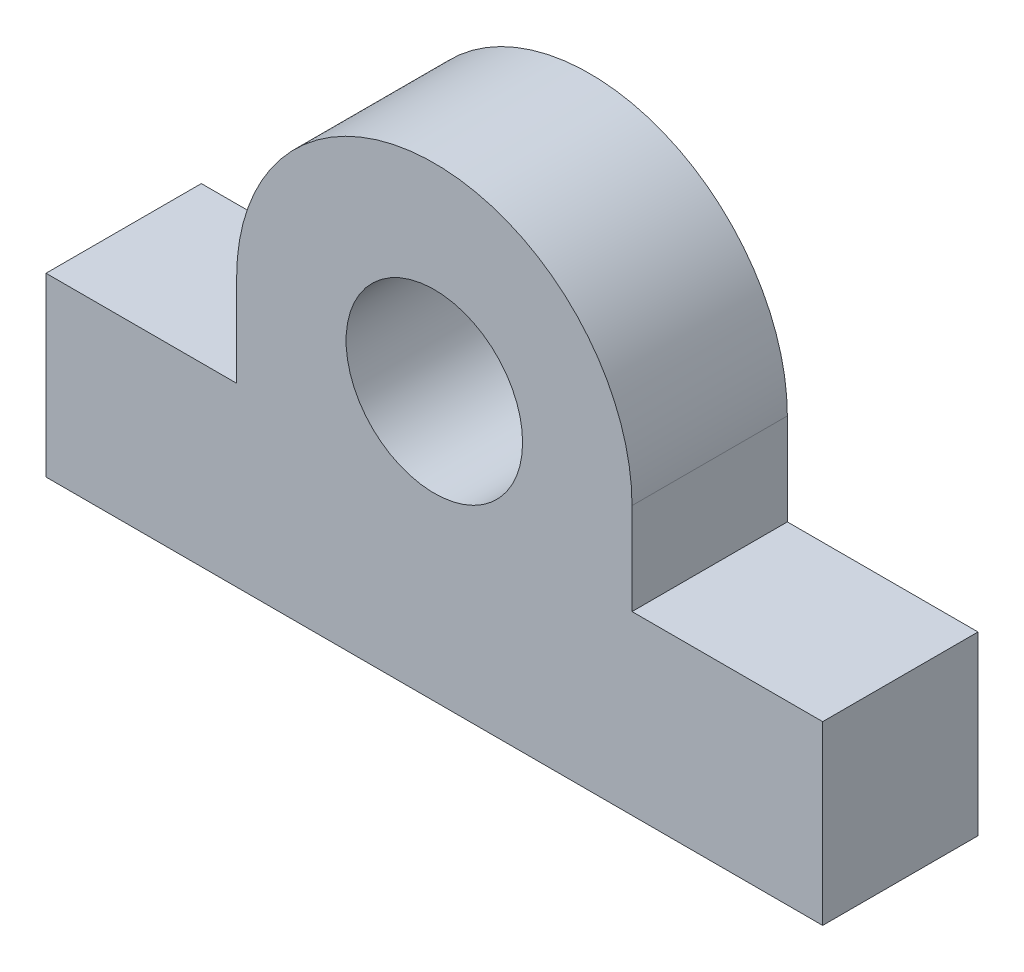
ISO-10303-21;
HEADER;
FILE_DESCRIPTION(('STEP AP214'),'2;1');
FILE_NAME('part.step','',(''),(''),'','','');
FILE_SCHEMA(('AUTOMOTIVE_DESIGN { 1 0 10303 214 1 1 1 1 }'));
ENDSEC;
DATA;
#1=APPLICATION_CONTEXT('core data for automotive mechanical design processes');
#2=APPLICATION_PROTOCOL_DEFINITION('international standard','automotive_design',2000,#1);
#3=PRODUCT_CONTEXT('',#1,'mechanical');
#4=PRODUCT('Part','Part','',(#3));
#5=PRODUCT_RELATED_PRODUCT_CATEGORY('part','',(#4));
#6=PRODUCT_DEFINITION_FORMATION('','',#4);
#7=PRODUCT_DEFINITION_CONTEXT('part definition',#1,'design');
#8=PRODUCT_DEFINITION('design','',#6,#7);
#9=PRODUCT_DEFINITION_SHAPE('','',#8);
#10=(LENGTH_UNIT() NAMED_UNIT(*) SI_UNIT(.MILLI.,.METRE.));
#11=(NAMED_UNIT(*) PLANE_ANGLE_UNIT() SI_UNIT($,.RADIAN.));
#12=(NAMED_UNIT(*) SI_UNIT($,.STERADIAN.) SOLID_ANGLE_UNIT());
#13=UNCERTAINTY_MEASURE_WITH_UNIT(LENGTH_MEASURE(1.E-05),#10,'distance_accuracy_value','');
#14=(GEOMETRIC_REPRESENTATION_CONTEXT(3) GLOBAL_UNCERTAINTY_ASSIGNED_CONTEXT((#13)) GLOBAL_UNIT_ASSIGNED_CONTEXT((#10,
#11,#12)) REPRESENTATION_CONTEXT('',''));
#15=CARTESIAN_POINT('',(0.,0.,0.));
#16=DIRECTION('',(0.,0.,1.));
#17=DIRECTION('',(1.,0.,0.));
#18=AXIS2_PLACEMENT_3D('',#15,#16,#17);
#19=CARTESIAN_POINT('',(0.,38.,11.));
#20=DIRECTION('',(0.,0.,-1.));
#21=DIRECTION('',(-1.,0.,0.));
#22=AXIS2_PLACEMENT_3D('',#19,#20,#21);
#23=PLANE('',#22);
#24=DIRECTION('',(0.,-1.,0.));
#25=VECTOR('',#24,1.);
#26=CARTESIAN_POINT('',(-55.,0.,11.));
#27=LINE('',#26,#25);
#28=CARTESIAN_POINT('',(-55.,25.,11.));
#29=VERTEX_POINT('',#28);
#30=CARTESIAN_POINT('',(-55.,0.,11.));
#31=VERTEX_POINT('',#30);
#32=EDGE_CURVE('E144',#29,#31,#27,.T.);
#33=ORIENTED_EDGE('',*,*,#32,.T.);
#34=DIRECTION('',(1.,0.,0.));
#35=VECTOR('',#34,1.);
#36=CARTESIAN_POINT('',(-55.,0.,11.));
#37=LINE('',#36,#35);
#38=CARTESIAN_POINT('',(55.,0.,11.));
#39=VERTEX_POINT('',#38);
#40=EDGE_CURVE('E92',#31,#39,#37,.T.);
#41=ORIENTED_EDGE('',*,*,#40,.T.);
#42=DIRECTION('',(0.,1.,0.));
#43=VECTOR('',#42,1.);
#44=CARTESIAN_POINT('',(55.,0.,11.));
#45=LINE('',#44,#43);
#46=CARTESIAN_POINT('',(55.,25.,11.));
#47=VERTEX_POINT('',#46);
#48=EDGE_CURVE('E159',#39,#47,#45,.T.);
#49=ORIENTED_EDGE('',*,*,#48,.T.);
#50=DIRECTION('',(-1.,0.,0.));
#51=VECTOR('',#50,1.);
#52=CARTESIAN_POINT('',(28.,25.,11.));
#53=LINE('',#52,#51);
#54=CARTESIAN_POINT('',(28.,25.,11.));
#55=VERTEX_POINT('',#54);
#56=EDGE_CURVE('E172',#47,#55,#53,.T.);
#57=ORIENTED_EDGE('',*,*,#56,.T.);
#58=DIRECTION('',(0.,1.,0.));
#59=VECTOR('',#58,1.);
#60=CARTESIAN_POINT('',(28.,25.,11.));
#61=LINE('',#60,#59);
#62=CARTESIAN_POINT('',(28.,38.,11.));
#63=VERTEX_POINT('',#62);
#64=EDGE_CURVE('E111',#55,#63,#61,.T.);
#65=ORIENTED_EDGE('',*,*,#64,.T.);
#66=CARTESIAN_POINT('',(0.,38.,11.));
#67=DIRECTION('',(0.,0.,1.));
#68=DIRECTION('',(-1.,0.,0.));
#69=AXIS2_PLACEMENT_3D('',#66,#67,#68);
#70=CIRCLE('',#69,28.);
#71=CARTESIAN_POINT('',(-28.,38.,11.));
#72=VERTEX_POINT('',#71);
#73=EDGE_CURVE('E105',#63,#72,#70,.T.);
#74=ORIENTED_EDGE('',*,*,#73,.T.);
#75=DIRECTION('',(0.,-1.,0.));
#76=VECTOR('',#75,1.);
#77=CARTESIAN_POINT('',(-28.,25.,11.));
#78=LINE('',#77,#76);
#79=CARTESIAN_POINT('',(-28.,25.,11.));
#80=VERTEX_POINT('',#79);
#81=EDGE_CURVE('E109',#72,#80,#78,.T.);
#82=ORIENTED_EDGE('',*,*,#81,.T.);
#83=DIRECTION('',(-1.,0.,0.));
#84=VECTOR('',#83,1.);
#85=CARTESIAN_POINT('',(-55.,25.,11.));
#86=LINE('',#85,#84);
#87=EDGE_CURVE('E49',#80,#29,#86,.T.);
#88=ORIENTED_EDGE('',*,*,#87,.T.);
#89=EDGE_LOOP('',(#33,#41,#49,#57,#65,#74,#82,#88));
#90=FACE_BOUND('',#89,.T.);
#91=CARTESIAN_POINT('',(0.,38.,11.));
#92=DIRECTION('',(0.,0.,1.));
#93=DIRECTION('',(1.,0.,0.));
#94=AXIS2_PLACEMENT_3D('',#91,#92,#93);
#95=CIRCLE('',#94,12.5);
#96=CARTESIAN_POINT('',(12.5,38.,11.));
#97=VERTEX_POINT('',#96);
#98=EDGE_CURVE('E133',#97,#97,#95,.T.);
#99=ORIENTED_EDGE('',*,*,#98,.F.);
#100=EDGE_LOOP('',(#99));
#101=FACE_BOUND('',#100,.T.);
#102=ADVANCED_FACE('F32',(#90,#101),#23,.F.);
#103=CARTESIAN_POINT('',(0.,38.,-11.));
#104=DIRECTION('',(0.,0.,-1.));
#105=DIRECTION('',(-1.,0.,0.));
#106=AXIS2_PLACEMENT_3D('',#103,#104,#105);
#107=PLANE('',#106);
#108=DIRECTION('',(0.,-1.,0.));
#109=VECTOR('',#108,1.);
#110=CARTESIAN_POINT('',(-55.,0.,-11.));
#111=LINE('',#110,#109);
#112=CARTESIAN_POINT('',(-55.,25.,-11.));
#113=VERTEX_POINT('',#112);
#114=CARTESIAN_POINT('',(-55.,0.,-11.));
#115=VERTEX_POINT('',#114);
#116=EDGE_CURVE('E129',#113,#115,#111,.T.);
#117=ORIENTED_EDGE('',*,*,#116,.F.);
#118=DIRECTION('',(-1.,0.,0.));
#119=VECTOR('',#118,1.);
#120=CARTESIAN_POINT('',(-55.,25.,-11.));
#121=LINE('',#120,#119);
#122=CARTESIAN_POINT('',(-28.,25.,-11.));
#123=VERTEX_POINT('',#122);
#124=EDGE_CURVE('E84',#123,#113,#121,.T.);
#125=ORIENTED_EDGE('',*,*,#124,.F.);
#126=DIRECTION('',(0.,-1.,0.));
#127=VECTOR('',#126,1.);
#128=CARTESIAN_POINT('',(-28.,25.,-11.));
#129=LINE('',#128,#127);
#130=CARTESIAN_POINT('',(-28.,38.,-11.));
#131=VERTEX_POINT('',#130);
#132=EDGE_CURVE('E78',#131,#123,#129,.T.);
#133=ORIENTED_EDGE('',*,*,#132,.F.);
#134=CARTESIAN_POINT('',(0.,38.,-11.));
#135=DIRECTION('',(0.,0.,1.));
#136=DIRECTION('',(-1.,0.,0.));
#137=AXIS2_PLACEMENT_3D('',#134,#135,#136);
#138=CIRCLE('',#137,28.);
#139=CARTESIAN_POINT('',(28.,38.,-11.));
#140=VERTEX_POINT('',#139);
#141=EDGE_CURVE('E119',#140,#131,#138,.T.);
#142=ORIENTED_EDGE('',*,*,#141,.F.);
#143=DIRECTION('',(0.,1.,0.));
#144=VECTOR('',#143,1.);
#145=CARTESIAN_POINT('',(28.,25.,-11.));
#146=LINE('',#145,#144);
#147=CARTESIAN_POINT('',(28.,25.,-11.));
#148=VERTEX_POINT('',#147);
#149=EDGE_CURVE('E139',#148,#140,#146,.T.);
#150=ORIENTED_EDGE('',*,*,#149,.F.);
#151=DIRECTION('',(-1.,0.,0.));
#152=VECTOR('',#151,1.);
#153=CARTESIAN_POINT('',(28.,25.,-11.));
#154=LINE('',#153,#152);
#155=CARTESIAN_POINT('',(55.,25.,-11.));
#156=VERTEX_POINT('',#155);
#157=EDGE_CURVE('E137',#156,#148,#154,.T.);
#158=ORIENTED_EDGE('',*,*,#157,.F.);
#159=DIRECTION('',(0.,1.,0.));
#160=VECTOR('',#159,1.);
#161=CARTESIAN_POINT('',(55.,0.,-11.));
#162=LINE('',#161,#160);
#163=CARTESIAN_POINT('',(55.,0.,-11.));
#164=VERTEX_POINT('',#163);
#165=EDGE_CURVE('E135',#164,#156,#162,.T.);
#166=ORIENTED_EDGE('',*,*,#165,.F.);
#167=DIRECTION('',(1.,0.,0.));
#168=VECTOR('',#167,1.);
#169=CARTESIAN_POINT('',(-55.,0.,-11.));
#170=LINE('',#169,#168);
#171=EDGE_CURVE('E132',#115,#164,#170,.T.);
#172=ORIENTED_EDGE('',*,*,#171,.F.);
#173=EDGE_LOOP('',(#117,#125,#133,#142,#150,#158,#166,#172));
#174=FACE_BOUND('',#173,.T.);
#175=CARTESIAN_POINT('',(0.,38.,-11.));
#176=DIRECTION('',(0.,0.,1.));
#177=DIRECTION('',(1.,0.,0.));
#178=AXIS2_PLACEMENT_3D('',#175,#176,#177);
#179=CIRCLE('',#178,12.5);
#180=CARTESIAN_POINT('',(12.5,38.,-11.));
#181=VERTEX_POINT('',#180);
#182=EDGE_CURVE('E178',#181,#181,#179,.T.);
#183=ORIENTED_EDGE('',*,*,#182,.T.);
#184=EDGE_LOOP('',(#183));
#185=FACE_BOUND('',#184,.T.);
#186=ADVANCED_FACE('F163',(#174,#185),#107,.T.);
#187=CARTESIAN_POINT('',(-55.,0.,11.));
#188=DIRECTION('',(1.,0.,0.));
#189=DIRECTION('',(0.,0.,-1.));
#190=AXIS2_PLACEMENT_3D('',#187,#188,#189);
#191=PLANE('',#190);
#192=ORIENTED_EDGE('',*,*,#116,.T.);
#193=DIRECTION('',(0.,0.,-1.));
#194=VECTOR('',#193,1.);
#195=CARTESIAN_POINT('',(-55.,0.,11.));
#196=LINE('',#195,#194);
#197=EDGE_CURVE('E11',#31,#115,#196,.T.);
#198=ORIENTED_EDGE('',*,*,#197,.F.);
#199=ORIENTED_EDGE('',*,*,#32,.F.);
#200=DIRECTION('',(0.,0.,-1.));
#201=VECTOR('',#200,1.);
#202=CARTESIAN_POINT('',(-55.,25.,11.));
#203=LINE('',#202,#201);
#204=EDGE_CURVE('E125',#29,#113,#203,.T.);
#205=ORIENTED_EDGE('',*,*,#204,.T.);
#206=EDGE_LOOP('',(#192,#198,#199,#205));
#207=FACE_BOUND('',#206,.T.);
#208=ADVANCED_FACE('F34',(#207),#191,.F.);
#209=CARTESIAN_POINT('',(-55.,0.,11.));
#210=DIRECTION('',(0.,1.,0.));
#211=DIRECTION('',(0.,0.,1.));
#212=AXIS2_PLACEMENT_3D('',#209,#210,#211);
#213=PLANE('',#212);
#214=ORIENTED_EDGE('',*,*,#171,.T.);
#215=DIRECTION('',(0.,0.,-1.));
#216=VECTOR('',#215,1.);
#217=CARTESIAN_POINT('',(55.,0.,11.));
#218=LINE('',#217,#216);
#219=EDGE_CURVE('E41',#39,#164,#218,.T.);
#220=ORIENTED_EDGE('',*,*,#219,.F.);
#221=ORIENTED_EDGE('',*,*,#40,.F.);
#222=ORIENTED_EDGE('',*,*,#197,.T.);
#223=EDGE_LOOP('',(#214,#220,#221,#222));
#224=FACE_BOUND('',#223,.T.);
#225=ADVANCED_FACE('F206',(#224),#213,.F.);
#226=CARTESIAN_POINT('',(55.,0.,11.));
#227=DIRECTION('',(-1.,0.,0.));
#228=DIRECTION('',(0.,-1.,0.));
#229=AXIS2_PLACEMENT_3D('',#226,#227,#228);
#230=PLANE('',#229);
#231=ORIENTED_EDGE('',*,*,#165,.T.);
#232=DIRECTION('',(0.,0.,-1.));
#233=VECTOR('',#232,1.);
#234=CARTESIAN_POINT('',(55.,25.,11.));
#235=LINE('',#234,#233);
#236=EDGE_CURVE('E151',#47,#156,#235,.T.);
#237=ORIENTED_EDGE('',*,*,#236,.F.);
#238=ORIENTED_EDGE('',*,*,#48,.F.);
#239=ORIENTED_EDGE('',*,*,#219,.T.);
#240=EDGE_LOOP('',(#231,#237,#238,#239));
#241=FACE_BOUND('',#240,.T.);
#242=ADVANCED_FACE('F157',(#241),#230,.F.);
#243=CARTESIAN_POINT('',(28.,25.,11.));
#244=DIRECTION('',(0.,-1.,0.));
#245=DIRECTION('',(1.,0.,0.));
#246=AXIS2_PLACEMENT_3D('',#243,#244,#245);
#247=PLANE('',#246);
#248=ORIENTED_EDGE('',*,*,#157,.T.);
#249=DIRECTION('',(0.,0.,-1.));
#250=VECTOR('',#249,1.);
#251=CARTESIAN_POINT('',(28.,25.,11.));
#252=LINE('',#251,#250);
#253=EDGE_CURVE('E148',#55,#148,#252,.T.);
#254=ORIENTED_EDGE('',*,*,#253,.F.);
#255=ORIENTED_EDGE('',*,*,#56,.F.);
#256=ORIENTED_EDGE('',*,*,#236,.T.);
#257=EDGE_LOOP('',(#248,#254,#255,#256));
#258=FACE_BOUND('',#257,.T.);
#259=ADVANCED_FACE('F168',(#258),#247,.F.);
#260=CARTESIAN_POINT('',(28.,25.,11.));
#261=DIRECTION('',(-1.,0.,0.));
#262=DIRECTION('',(0.,-1.,0.));
#263=AXIS2_PLACEMENT_3D('',#260,#261,#262);
#264=PLANE('',#263);
#265=ORIENTED_EDGE('',*,*,#149,.T.);
#266=DIRECTION('',(0.,0.,-1.));
#267=VECTOR('',#266,1.);
#268=CARTESIAN_POINT('',(28.,38.,11.));
#269=LINE('',#268,#267);
#270=EDGE_CURVE('E120',#63,#140,#269,.T.);
#271=ORIENTED_EDGE('',*,*,#270,.F.);
#272=ORIENTED_EDGE('',*,*,#64,.F.);
#273=ORIENTED_EDGE('',*,*,#253,.T.);
#274=EDGE_LOOP('',(#265,#271,#272,#273));
#275=FACE_BOUND('',#274,.T.);
#276=ADVANCED_FACE('F171',(#275),#264,.F.);
#277=CARTESIAN_POINT('',(0.,38.,11.));
#278=DIRECTION('',(0.,0.,-1.));
#279=DIRECTION('',(-1.,0.,0.));
#280=AXIS2_PLACEMENT_3D('',#277,#278,#279);
#281=CYLINDRICAL_SURFACE('',#280,28.);
#282=ORIENTED_EDGE('',*,*,#141,.T.);
#283=DIRECTION('',(0.,0.,-1.));
#284=VECTOR('',#283,1.);
#285=CARTESIAN_POINT('',(-28.,38.,11.));
#286=LINE('',#285,#284);
#287=EDGE_CURVE('E116',#72,#131,#286,.T.);
#288=ORIENTED_EDGE('',*,*,#287,.F.);
#289=ORIENTED_EDGE('',*,*,#73,.F.);
#290=ORIENTED_EDGE('',*,*,#270,.T.);
#291=EDGE_LOOP('',(#282,#288,#289,#290));
#292=FACE_BOUND('',#291,.T.);
#293=ADVANCED_FACE('F117',(#292),#281,.T.);
#294=CARTESIAN_POINT('',(-28.,25.,11.));
#295=DIRECTION('',(1.,0.,0.));
#296=DIRECTION('',(0.,1.,0.));
#297=AXIS2_PLACEMENT_3D('',#294,#295,#296);
#298=PLANE('',#297);
#299=ORIENTED_EDGE('',*,*,#132,.T.);
#300=DIRECTION('',(0.,0.,-1.));
#301=VECTOR('',#300,1.);
#302=CARTESIAN_POINT('',(-28.,25.,11.));
#303=LINE('',#302,#301);
#304=EDGE_CURVE('E121',#80,#123,#303,.T.);
#305=ORIENTED_EDGE('',*,*,#304,.F.);
#306=ORIENTED_EDGE('',*,*,#81,.F.);
#307=ORIENTED_EDGE('',*,*,#287,.T.);
#308=EDGE_LOOP('',(#299,#305,#306,#307));
#309=FACE_BOUND('',#308,.T.);
#310=ADVANCED_FACE('F123',(#309),#298,.F.);
#311=CARTESIAN_POINT('',(-55.,25.,11.));
#312=DIRECTION('',(0.,-1.,0.));
#313=DIRECTION('',(1.,0.,0.));
#314=AXIS2_PLACEMENT_3D('',#311,#312,#313);
#315=PLANE('',#314);
#316=ORIENTED_EDGE('',*,*,#124,.T.);
#317=ORIENTED_EDGE('',*,*,#204,.F.);
#318=ORIENTED_EDGE('',*,*,#87,.F.);
#319=ORIENTED_EDGE('',*,*,#304,.T.);
#320=EDGE_LOOP('',(#316,#317,#318,#319));
#321=FACE_BOUND('',#320,.T.);
#322=ADVANCED_FACE('F194',(#321),#315,.F.);
#323=CARTESIAN_POINT('',(0.,38.,11.));
#324=DIRECTION('',(0.,0.,-1.));
#325=DIRECTION('',(-1.,0.,0.));
#326=AXIS2_PLACEMENT_3D('',#323,#324,#325);
#327=CYLINDRICAL_SURFACE('',#326,12.5);
#328=ORIENTED_EDGE('',*,*,#98,.T.);
#329=EDGE_LOOP('',(#328));
#330=FACE_BOUND('',#329,.T.);
#331=ORIENTED_EDGE('',*,*,#182,.F.);
#332=EDGE_LOOP('',(#331));
#333=FACE_BOUND('',#332,.T.);
#334=ADVANCED_FACE('F184',(#330,#333),#327,.F.);
#335=CLOSED_SHELL('',(#102,#186,#208,#225,#242,#259,#276,#293,#310,#322,#334));
#336=MANIFOLD_SOLID_BREP('B2',#335);
#337=ADVANCED_BREP_SHAPE_REPRESENTATION('',(#18,#336),#14);
#338=SHAPE_DEFINITION_REPRESENTATION(#9,#337);
ENDSEC;
END-ISO-10303-21;
